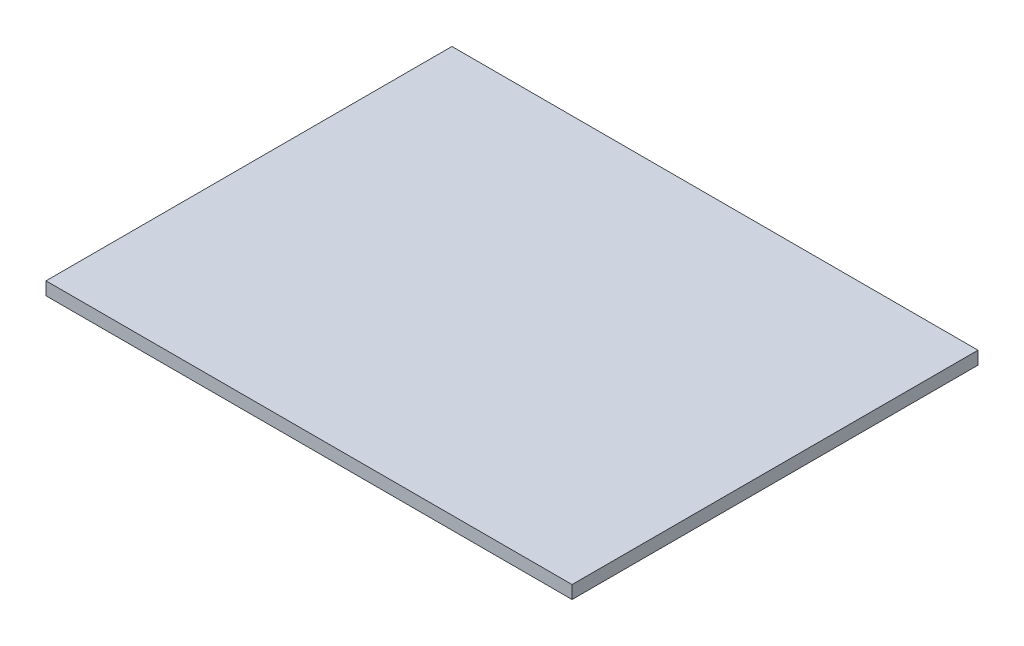
ISO-10303-21;
HEADER;
FILE_DESCRIPTION(('STEP AP214'),'2;1');
FILE_NAME('part.step','',(''),(''),'','','');
FILE_SCHEMA(('AUTOMOTIVE_DESIGN { 1 0 10303 214 1 1 1 1 }'));
ENDSEC;
DATA;
#1=APPLICATION_CONTEXT('core data for automotive mechanical design processes');
#2=APPLICATION_PROTOCOL_DEFINITION('international standard','automotive_design',2000,#1);
#3=PRODUCT_CONTEXT('',#1,'mechanical');
#4=PRODUCT('Part','Part','',(#3));
#5=PRODUCT_RELATED_PRODUCT_CATEGORY('part','',(#4));
#6=PRODUCT_DEFINITION_FORMATION('','',#4);
#7=PRODUCT_DEFINITION_CONTEXT('part definition',#1,'design');
#8=PRODUCT_DEFINITION('design','',#6,#7);
#9=PRODUCT_DEFINITION_SHAPE('','',#8);
#10=(LENGTH_UNIT() NAMED_UNIT(*) SI_UNIT(.MILLI.,.METRE.));
#11=(NAMED_UNIT(*) PLANE_ANGLE_UNIT() SI_UNIT($,.RADIAN.));
#12=(NAMED_UNIT(*) SI_UNIT($,.STERADIAN.) SOLID_ANGLE_UNIT());
#13=UNCERTAINTY_MEASURE_WITH_UNIT(LENGTH_MEASURE(1.E-05),#10,'distance_accuracy_value','');
#14=(GEOMETRIC_REPRESENTATION_CONTEXT(3) GLOBAL_UNCERTAINTY_ASSIGNED_CONTEXT((#13)) GLOBAL_UNIT_ASSIGNED_CONTEXT((#10,
#11,#12)) REPRESENTATION_CONTEXT('',''));
#15=CARTESIAN_POINT('',(0.,0.,0.));
#16=DIRECTION('',(0.,0.,1.));
#17=DIRECTION('',(1.,0.,0.));
#18=AXIS2_PLACEMENT_3D('',#15,#16,#17);
#19=CARTESIAN_POINT('',(-61.7073751729736,16.,-455.417401392111));
#20=DIRECTION('',(1.,0.,0.));
#21=DIRECTION('',(0.,0.,-1.));
#22=AXIS2_PLACEMENT_3D('',#19,#20,#21);
#23=PLANE('',#22);
#24=DIRECTION('',(0.,0.,1.));
#25=VECTOR('',#24,1.);
#26=CARTESIAN_POINT('',(-61.7073751729736,0.,-455.417401392111));
#27=LINE('',#26,#25);
#28=CARTESIAN_POINT('',(-61.7073751729736,0.,-455.417401392111));
#29=VERTEX_POINT('',#28);
#30=CARTESIAN_POINT('',(-61.7073751729735,0.,44.5825986078886));
#31=VERTEX_POINT('',#30);
#32=EDGE_CURVE('E96',#29,#31,#27,.T.);
#33=ORIENTED_EDGE('',*,*,#32,.T.);
#34=DIRECTION('',(0.,-1.,0.));
#35=VECTOR('',#34,1.);
#36=CARTESIAN_POINT('',(-61.7073751729735,16.,44.5825986078886));
#37=LINE('',#36,#35);
#38=CARTESIAN_POINT('',(-61.7073751729735,16.,44.5825986078886));
#39=VERTEX_POINT('',#38);
#40=EDGE_CURVE('E11',#39,#31,#37,.T.);
#41=ORIENTED_EDGE('',*,*,#40,.F.);
#42=DIRECTION('',(0.,0.,1.));
#43=VECTOR('',#42,1.);
#44=CARTESIAN_POINT('',(-61.7073751729736,16.,-455.417401392111));
#45=LINE('',#44,#43);
#46=CARTESIAN_POINT('',(-61.7073751729736,16.,-455.417401392111));
#47=VERTEX_POINT('',#46);
#48=EDGE_CURVE('E84',#47,#39,#45,.T.);
#49=ORIENTED_EDGE('',*,*,#48,.F.);
#50=DIRECTION('',(0.,-1.,0.));
#51=VECTOR('',#50,1.);
#52=CARTESIAN_POINT('',(-61.7073751729736,16.,-455.417401392111));
#53=LINE('',#52,#51);
#54=EDGE_CURVE('E92',#47,#29,#53,.T.);
#55=ORIENTED_EDGE('',*,*,#54,.T.);
#56=EDGE_LOOP('',(#33,#41,#49,#55));
#57=FACE_BOUND('',#56,.T.);
#58=ADVANCED_FACE('F33',(#57),#23,.F.);
#59=CARTESIAN_POINT('',(-61.7073751729735,16.,44.5825986078886));
#60=DIRECTION('',(0.,0.,-1.));
#61=DIRECTION('',(-1.,0.,0.));
#62=AXIS2_PLACEMENT_3D('',#59,#60,#61);
#63=PLANE('',#62);
#64=DIRECTION('',(1.,0.,0.));
#65=VECTOR('',#64,1.);
#66=CARTESIAN_POINT('',(-61.7073751729735,0.,44.5825986078886));
#67=LINE('',#66,#65);
#68=CARTESIAN_POINT('',(586.292624827027,0.,44.5825986078886));
#69=VERTEX_POINT('',#68);
#70=EDGE_CURVE('E88',#31,#69,#67,.T.);
#71=ORIENTED_EDGE('',*,*,#70,.T.);
#72=DIRECTION('',(0.,-1.,0.));
#73=VECTOR('',#72,1.);
#74=CARTESIAN_POINT('',(586.292624827027,16.,44.5825986078886));
#75=LINE('',#74,#73);
#76=CARTESIAN_POINT('',(586.292624827027,16.,44.5825986078886));
#77=VERTEX_POINT('',#76);
#78=EDGE_CURVE('E41',#77,#69,#75,.T.);
#79=ORIENTED_EDGE('',*,*,#78,.F.);
#80=DIRECTION('',(1.,0.,0.));
#81=VECTOR('',#80,1.);
#82=CARTESIAN_POINT('',(-61.7073751729735,16.,44.5825986078886));
#83=LINE('',#82,#81);
#84=EDGE_CURVE('E79',#39,#77,#83,.T.);
#85=ORIENTED_EDGE('',*,*,#84,.F.);
#86=ORIENTED_EDGE('',*,*,#40,.T.);
#87=EDGE_LOOP('',(#71,#79,#85,#86));
#88=FACE_BOUND('',#87,.T.);
#89=ADVANCED_FACE('F87',(#88),#63,.F.);
#90=CARTESIAN_POINT('',(586.292624827026,16.,-455.417401392111));
#91=DIRECTION('',(-1.,0.,0.));
#92=DIRECTION('',(0.,0.,1.));
#93=AXIS2_PLACEMENT_3D('',#90,#91,#92);
#94=PLANE('',#93);
#95=DIRECTION('',(0.,0.,-1.));
#96=VECTOR('',#95,1.);
#97=CARTESIAN_POINT('',(586.292624827026,0.,-455.417401392111));
#98=LINE('',#97,#96);
#99=CARTESIAN_POINT('',(586.292624827026,0.,-455.417401392111));
#100=VERTEX_POINT('',#99);
#101=EDGE_CURVE('E66',#69,#100,#98,.T.);
#102=ORIENTED_EDGE('',*,*,#101,.T.);
#103=DIRECTION('',(0.,-1.,0.));
#104=VECTOR('',#103,1.);
#105=CARTESIAN_POINT('',(586.292624827026,16.,-455.417401392111));
#106=LINE('',#105,#104);
#107=CARTESIAN_POINT('',(586.292624827026,16.,-455.417401392111));
#108=VERTEX_POINT('',#107);
#109=EDGE_CURVE('E89',#108,#100,#106,.T.);
#110=ORIENTED_EDGE('',*,*,#109,.F.);
#111=DIRECTION('',(0.,0.,-1.));
#112=VECTOR('',#111,1.);
#113=CARTESIAN_POINT('',(586.292624827026,16.,-455.417401392111));
#114=LINE('',#113,#112);
#115=EDGE_CURVE('E82',#77,#108,#114,.T.);
#116=ORIENTED_EDGE('',*,*,#115,.F.);
#117=ORIENTED_EDGE('',*,*,#78,.T.);
#118=EDGE_LOOP('',(#102,#110,#116,#117));
#119=FACE_BOUND('',#118,.T.);
#120=ADVANCED_FACE('F90',(#119),#94,.F.);
#121=CARTESIAN_POINT('',(-61.7073751729736,16.,-455.417401392111));
#122=DIRECTION('',(0.,0.,1.));
#123=DIRECTION('',(1.,0.,0.));
#124=AXIS2_PLACEMENT_3D('',#121,#122,#123);
#125=PLANE('',#124);
#126=DIRECTION('',(-1.,0.,0.));
#127=VECTOR('',#126,1.);
#128=CARTESIAN_POINT('',(-61.7073751729736,0.,-455.417401392111));
#129=LINE('',#128,#127);
#130=EDGE_CURVE('E72',#100,#29,#129,.T.);
#131=ORIENTED_EDGE('',*,*,#130,.T.);
#132=ORIENTED_EDGE('',*,*,#54,.F.);
#133=DIRECTION('',(-1.,0.,0.));
#134=VECTOR('',#133,1.);
#135=CARTESIAN_POINT('',(-61.7073751729736,16.,-455.417401392111));
#136=LINE('',#135,#134);
#137=EDGE_CURVE('E49',#108,#47,#136,.T.);
#138=ORIENTED_EDGE('',*,*,#137,.F.);
#139=ORIENTED_EDGE('',*,*,#109,.T.);
#140=EDGE_LOOP('',(#131,#132,#138,#139));
#141=FACE_BOUND('',#140,.T.);
#142=ADVANCED_FACE('F103',(#141),#125,.F.);
#143=CARTESIAN_POINT('',(0.,16.,0.));
#144=DIRECTION('',(0.,1.,0.));
#145=DIRECTION('',(0.,0.,1.));
#146=AXIS2_PLACEMENT_3D('',#143,#144,#145);
#147=PLANE('',#146);
#148=ORIENTED_EDGE('',*,*,#48,.T.);
#149=ORIENTED_EDGE('',*,*,#84,.T.);
#150=ORIENTED_EDGE('',*,*,#115,.T.);
#151=ORIENTED_EDGE('',*,*,#137,.T.);
#152=EDGE_LOOP('',(#148,#149,#150,#151));
#153=FACE_BOUND('',#152,.T.);
#154=ADVANCED_FACE('F80',(#153),#147,.T.);
#155=CARTESIAN_POINT('',(0.,0.,0.));
#156=DIRECTION('',(0.,1.,0.));
#157=DIRECTION('',(0.,0.,1.));
#158=AXIS2_PLACEMENT_3D('',#155,#156,#157);
#159=PLANE('',#158);
#160=ORIENTED_EDGE('',*,*,#32,.F.);
#161=ORIENTED_EDGE('',*,*,#130,.F.);
#162=ORIENTED_EDGE('',*,*,#101,.F.);
#163=ORIENTED_EDGE('',*,*,#70,.F.);
#164=EDGE_LOOP('',(#160,#161,#162,#163));
#165=FACE_BOUND('',#164,.T.);
#166=ADVANCED_FACE('F106',(#165),#159,.F.);
#167=CLOSED_SHELL('',(#58,#89,#120,#142,#154,#166));
#168=MANIFOLD_SOLID_BREP('B2',#167);
#169=ADVANCED_BREP_SHAPE_REPRESENTATION('',(#18,#168),#14);
#170=SHAPE_DEFINITION_REPRESENTATION(#9,#169);
ENDSEC;
END-ISO-10303-21;
